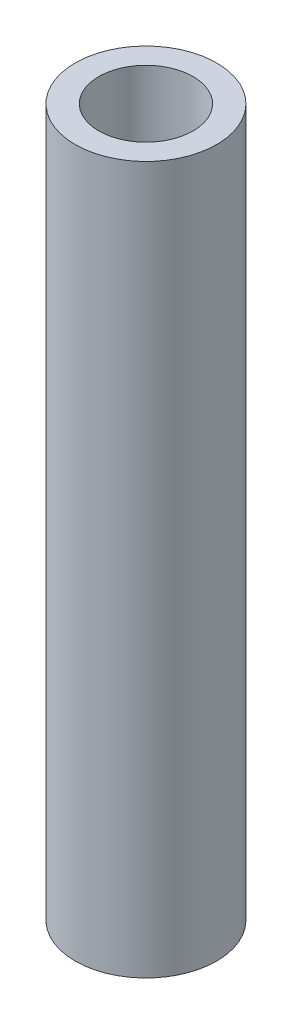
ISO-10303-21;
HEADER;
FILE_DESCRIPTION(('STEP AP214'),'2;1');
FILE_NAME('part.step','',(''),(''),'','','');
FILE_SCHEMA(('AUTOMOTIVE_DESIGN { 1 0 10303 214 1 1 1 1 }'));
ENDSEC;
DATA;
#1=APPLICATION_CONTEXT('core data for automotive mechanical design processes');
#2=APPLICATION_PROTOCOL_DEFINITION('international standard','automotive_design',2000,#1);
#3=PRODUCT_CONTEXT('',#1,'mechanical');
#4=PRODUCT('Part','Part','',(#3));
#5=PRODUCT_RELATED_PRODUCT_CATEGORY('part','',(#4));
#6=PRODUCT_DEFINITION_FORMATION('','',#4);
#7=PRODUCT_DEFINITION_CONTEXT('part definition',#1,'design');
#8=PRODUCT_DEFINITION('design','',#6,#7);
#9=PRODUCT_DEFINITION_SHAPE('','',#8);
#10=(LENGTH_UNIT() NAMED_UNIT(*) SI_UNIT(.MILLI.,.METRE.));
#11=(NAMED_UNIT(*) PLANE_ANGLE_UNIT() SI_UNIT($,.RADIAN.));
#12=(NAMED_UNIT(*) SI_UNIT($,.STERADIAN.) SOLID_ANGLE_UNIT());
#13=UNCERTAINTY_MEASURE_WITH_UNIT(LENGTH_MEASURE(1.E-05),#10,'distance_accuracy_value','');
#14=(GEOMETRIC_REPRESENTATION_CONTEXT(3) GLOBAL_UNCERTAINTY_ASSIGNED_CONTEXT((#13)) GLOBAL_UNIT_ASSIGNED_CONTEXT((#10,
#11,#12)) REPRESENTATION_CONTEXT('',''));
#15=CARTESIAN_POINT('',(0.,0.,0.));
#16=DIRECTION('',(0.,0.,1.));
#17=DIRECTION('',(1.,0.,0.));
#18=AXIS2_PLACEMENT_3D('',#15,#16,#17);
#19=CARTESIAN_POINT('',(0.,30.,0.));
#20=DIRECTION('',(0.,-1.,0.));
#21=DIRECTION('',(0.,0.,-1.));
#22=AXIS2_PLACEMENT_3D('',#19,#20,#21);
#23=CYLINDRICAL_SURFACE('',#22,3.);
#24=CARTESIAN_POINT('',(0.,30.,0.));
#25=DIRECTION('',(0.,1.,0.));
#26=DIRECTION('',(0.,0.,1.));
#27=AXIS2_PLACEMENT_3D('',#24,#25,#26);
#28=CIRCLE('',#27,3.);
#29=CARTESIAN_POINT('',(0.,30.,3.));
#30=VERTEX_POINT('',#29);
#31=EDGE_CURVE('E10',#30,#30,#28,.T.);
#32=ORIENTED_EDGE('',*,*,#31,.F.);
#33=EDGE_LOOP('',(#32));
#34=FACE_BOUND('',#33,.T.);
#35=CARTESIAN_POINT('',(0.,0.,0.));
#36=DIRECTION('',(0.,1.,0.));
#37=DIRECTION('',(0.,0.,1.));
#38=AXIS2_PLACEMENT_3D('',#35,#36,#37);
#39=CIRCLE('',#38,3.);
#40=CARTESIAN_POINT('',(0.,0.,3.));
#41=VERTEX_POINT('',#40);
#42=EDGE_CURVE('E46',#41,#41,#39,.T.);
#43=ORIENTED_EDGE('',*,*,#42,.T.);
#44=EDGE_LOOP('',(#43));
#45=FACE_BOUND('',#44,.T.);
#46=ADVANCED_FACE('F43',(#34,#45),#23,.T.);
#47=CARTESIAN_POINT('',(0.,30.,0.));
#48=DIRECTION('',(0.,1.,0.));
#49=DIRECTION('',(0.,0.,1.));
#50=AXIS2_PLACEMENT_3D('',#47,#48,#49);
#51=PLANE('',#50);
#52=CARTESIAN_POINT('',(0.,30.,0.));
#53=DIRECTION('',(0.,1.,0.));
#54=DIRECTION('',(0.,0.,1.));
#55=AXIS2_PLACEMENT_3D('',#52,#53,#54);
#56=CIRCLE('',#55,2.);
#57=CARTESIAN_POINT('',(0.,30.,2.));
#58=VERTEX_POINT('',#57);
#59=EDGE_CURVE('E57',#58,#58,#56,.T.);
#60=ORIENTED_EDGE('',*,*,#59,.F.);
#61=EDGE_LOOP('',(#60));
#62=FACE_BOUND('',#61,.T.);
#63=ORIENTED_EDGE('',*,*,#31,.T.);
#64=EDGE_LOOP('',(#63));
#65=FACE_BOUND('',#64,.T.);
#66=ADVANCED_FACE('F74',(#62,#65),#51,.T.);
#67=CARTESIAN_POINT('',(0.,0.,0.));
#68=DIRECTION('',(0.,1.,0.));
#69=DIRECTION('',(0.,0.,1.));
#70=AXIS2_PLACEMENT_3D('',#67,#68,#69);
#71=PLANE('',#70);
#72=CARTESIAN_POINT('',(0.,0.,0.));
#73=DIRECTION('',(0.,1.,0.));
#74=DIRECTION('',(0.,0.,1.));
#75=AXIS2_PLACEMENT_3D('',#72,#73,#74);
#76=CIRCLE('',#75,2.);
#77=CARTESIAN_POINT('',(0.,0.,2.));
#78=VERTEX_POINT('',#77);
#79=EDGE_CURVE('E55',#78,#78,#76,.T.);
#80=ORIENTED_EDGE('',*,*,#79,.T.);
#81=EDGE_LOOP('',(#80));
#82=FACE_BOUND('',#81,.T.);
#83=ORIENTED_EDGE('',*,*,#42,.F.);
#84=EDGE_LOOP('',(#83));
#85=FACE_BOUND('',#84,.T.);
#86=ADVANCED_FACE('F65',(#82,#85),#71,.F.);
#87=CARTESIAN_POINT('',(0.,0.,0.));
#88=DIRECTION('',(0.,1.,0.));
#89=DIRECTION('',(0.,0.,1.));
#90=AXIS2_PLACEMENT_3D('',#87,#88,#89);
#91=CYLINDRICAL_SURFACE('',#90,2.);
#92=ORIENTED_EDGE('',*,*,#79,.F.);
#93=EDGE_LOOP('',(#92));
#94=FACE_BOUND('',#93,.T.);
#95=ORIENTED_EDGE('',*,*,#59,.T.);
#96=EDGE_LOOP('',(#95));
#97=FACE_BOUND('',#96,.T.);
#98=ADVANCED_FACE('F68',(#94,#97),#91,.F.);
#99=CLOSED_SHELL('',(#46,#66,#86,#98));
#100=MANIFOLD_SOLID_BREP('B2',#99);
#101=ADVANCED_BREP_SHAPE_REPRESENTATION('',(#18,#100),#14);
#102=SHAPE_DEFINITION_REPRESENTATION(#9,#101);
ENDSEC;
END-ISO-10303-21;
